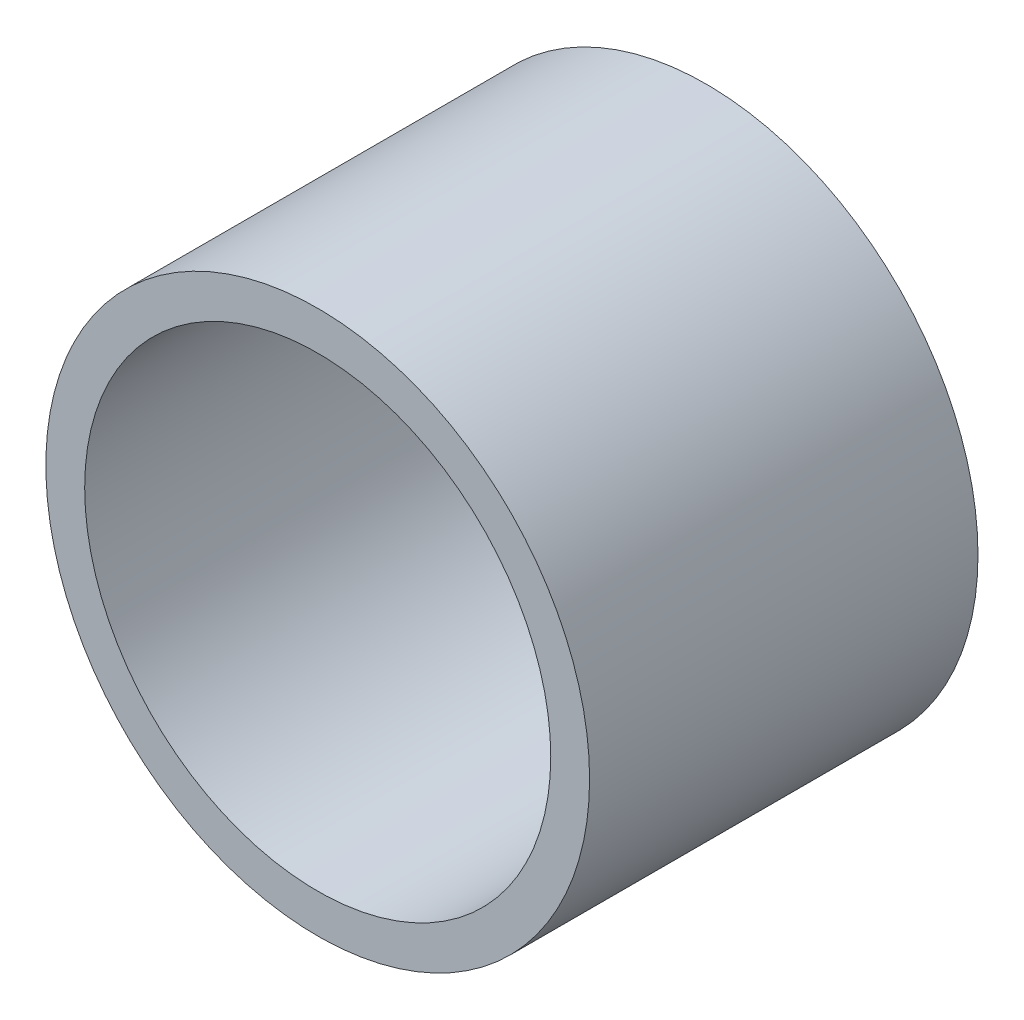
ISO-10303-21;
HEADER;
FILE_DESCRIPTION(('STEP AP214'),'2;1');
FILE_NAME('part.step','',(''),(''),'','','');
FILE_SCHEMA(('AUTOMOTIVE_DESIGN { 1 0 10303 214 1 1 1 1 }'));
ENDSEC;
DATA;
#1=APPLICATION_CONTEXT('core data for automotive mechanical design processes');
#2=APPLICATION_PROTOCOL_DEFINITION('international standard','automotive_design',2000,#1);
#3=PRODUCT_CONTEXT('',#1,'mechanical');
#4=PRODUCT('Part','Part','',(#3));
#5=PRODUCT_RELATED_PRODUCT_CATEGORY('part','',(#4));
#6=PRODUCT_DEFINITION_FORMATION('','',#4);
#7=PRODUCT_DEFINITION_CONTEXT('part definition',#1,'design');
#8=PRODUCT_DEFINITION('design','',#6,#7);
#9=PRODUCT_DEFINITION_SHAPE('','',#8);
#10=(LENGTH_UNIT() NAMED_UNIT(*) SI_UNIT(.MILLI.,.METRE.));
#11=(NAMED_UNIT(*) PLANE_ANGLE_UNIT() SI_UNIT($,.RADIAN.));
#12=(NAMED_UNIT(*) SI_UNIT($,.STERADIAN.) SOLID_ANGLE_UNIT());
#13=UNCERTAINTY_MEASURE_WITH_UNIT(LENGTH_MEASURE(1.E-05),#10,'distance_accuracy_value','');
#14=(GEOMETRIC_REPRESENTATION_CONTEXT(3) GLOBAL_UNCERTAINTY_ASSIGNED_CONTEXT((#13)) GLOBAL_UNIT_ASSIGNED_CONTEXT((#10,
#11,#12)) REPRESENTATION_CONTEXT('',''));
#15=CARTESIAN_POINT('',(0.,0.,0.));
#16=DIRECTION('',(0.,0.,1.));
#17=DIRECTION('',(1.,0.,0.));
#18=AXIS2_PLACEMENT_3D('',#15,#16,#17);
#19=CARTESIAN_POINT('',(0.,0.,5.));
#20=DIRECTION('',(0.,0.,1.));
#21=DIRECTION('',(1.,0.,0.));
#22=AXIS2_PLACEMENT_3D('',#19,#20,#21);
#23=PLANE('',#22);
#24=CARTESIAN_POINT('',(0.,0.,5.));
#25=DIRECTION('',(0.,0.,1.));
#26=DIRECTION('',(1.,0.,0.));
#27=AXIS2_PLACEMENT_3D('',#24,#25,#26);
#28=CIRCLE('',#27,3.5);
#29=CARTESIAN_POINT('',(3.5,0.,5.));
#30=VERTEX_POINT('',#29);
#31=EDGE_CURVE('E10',#30,#30,#28,.T.);
#32=ORIENTED_EDGE('',*,*,#31,.T.);
#33=EDGE_LOOP('',(#32));
#34=FACE_BOUND('',#33,.T.);
#35=CARTESIAN_POINT('',(0.,0.,5.));
#36=DIRECTION('',(0.,0.,1.));
#37=DIRECTION('',(1.,0.,0.));
#38=AXIS2_PLACEMENT_3D('',#35,#36,#37);
#39=CIRCLE('',#38,3.);
#40=CARTESIAN_POINT('',(3.,0.,5.));
#41=VERTEX_POINT('',#40);
#42=EDGE_CURVE('E42',#41,#41,#39,.T.);
#43=ORIENTED_EDGE('',*,*,#42,.F.);
#44=EDGE_LOOP('',(#43));
#45=FACE_BOUND('',#44,.T.);
#46=ADVANCED_FACE('F31',(#34,#45),#23,.T.);
#47=CARTESIAN_POINT('',(0.,0.,0.));
#48=DIRECTION('',(0.,0.,1.));
#49=DIRECTION('',(1.,0.,0.));
#50=AXIS2_PLACEMENT_3D('',#47,#48,#49);
#51=PLANE('',#50);
#52=CARTESIAN_POINT('',(0.,0.,0.));
#53=DIRECTION('',(0.,0.,1.));
#54=DIRECTION('',(1.,0.,0.));
#55=AXIS2_PLACEMENT_3D('',#52,#53,#54);
#56=CIRCLE('',#55,3.5);
#57=CARTESIAN_POINT('',(3.5,0.,0.));
#58=VERTEX_POINT('',#57);
#59=EDGE_CURVE('E35',#58,#58,#56,.T.);
#60=ORIENTED_EDGE('',*,*,#59,.F.);
#61=EDGE_LOOP('',(#60));
#62=FACE_BOUND('',#61,.T.);
#63=CARTESIAN_POINT('',(0.,0.,0.));
#64=DIRECTION('',(0.,0.,1.));
#65=DIRECTION('',(1.,0.,0.));
#66=AXIS2_PLACEMENT_3D('',#63,#64,#65);
#67=CIRCLE('',#66,3.);
#68=CARTESIAN_POINT('',(3.,0.,0.));
#69=VERTEX_POINT('',#68);
#70=EDGE_CURVE('E44',#69,#69,#67,.T.);
#71=ORIENTED_EDGE('',*,*,#70,.T.);
#72=EDGE_LOOP('',(#71));
#73=FACE_BOUND('',#72,.T.);
#74=ADVANCED_FACE('F54',(#62,#73),#51,.F.);
#75=CARTESIAN_POINT('',(0.,0.,5.));
#76=DIRECTION('',(0.,0.,-1.));
#77=DIRECTION('',(-1.,0.,0.));
#78=AXIS2_PLACEMENT_3D('',#75,#76,#77);
#79=CYLINDRICAL_SURFACE('',#78,3.5);
#80=ORIENTED_EDGE('',*,*,#31,.F.);
#81=EDGE_LOOP('',(#80));
#82=FACE_BOUND('',#81,.T.);
#83=ORIENTED_EDGE('',*,*,#59,.T.);
#84=EDGE_LOOP('',(#83));
#85=FACE_BOUND('',#84,.T.);
#86=ADVANCED_FACE('F33',(#82,#85),#79,.T.);
#87=CARTESIAN_POINT('',(0.,0.,5.));
#88=DIRECTION('',(0.,0.,-1.));
#89=DIRECTION('',(-1.,0.,0.));
#90=AXIS2_PLACEMENT_3D('',#87,#88,#89);
#91=CYLINDRICAL_SURFACE('',#90,3.);
#92=ORIENTED_EDGE('',*,*,#42,.T.);
#93=EDGE_LOOP('',(#92));
#94=FACE_BOUND('',#93,.T.);
#95=ORIENTED_EDGE('',*,*,#70,.F.);
#96=EDGE_LOOP('',(#95));
#97=FACE_BOUND('',#96,.T.);
#98=ADVANCED_FACE('F50',(#94,#97),#91,.F.);
#99=CLOSED_SHELL('',(#46,#74,#86,#98));
#100=MANIFOLD_SOLID_BREP('B2',#99);
#101=ADVANCED_BREP_SHAPE_REPRESENTATION('',(#18,#100),#14);
#102=SHAPE_DEFINITION_REPRESENTATION(#9,#101);
ENDSEC;
END-ISO-10303-21;
